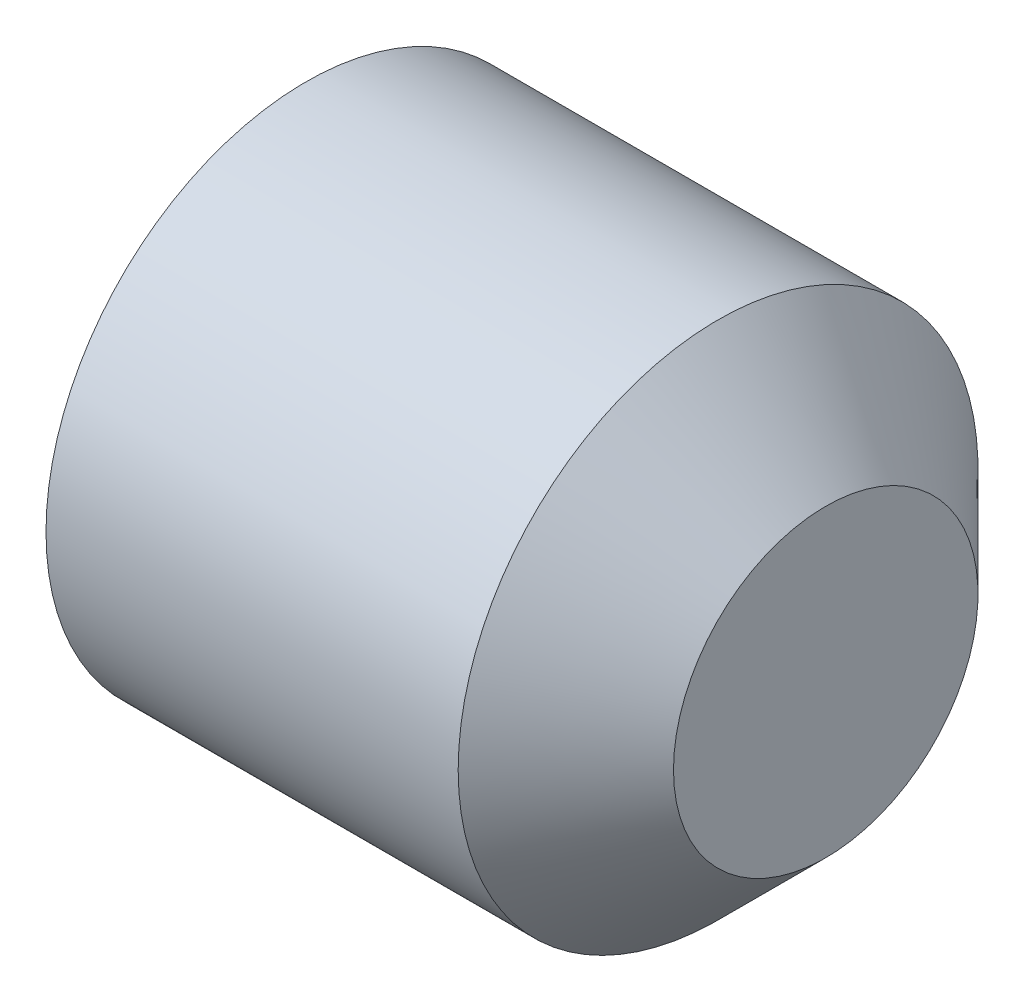
ISO-10303-21;
HEADER;
FILE_DESCRIPTION(('STEP AP214'),'2;1');
FILE_NAME('part.step','',(''),(''),'','','');
FILE_SCHEMA(('AUTOMOTIVE_DESIGN { 1 0 10303 214 1 1 1 1 }'));
ENDSEC;
DATA;
#1=APPLICATION_CONTEXT('core data for automotive mechanical design processes');
#2=APPLICATION_PROTOCOL_DEFINITION('international standard','automotive_design',2000,#1);
#3=PRODUCT_CONTEXT('',#1,'mechanical');
#4=PRODUCT('Part','Part','',(#3));
#5=PRODUCT_RELATED_PRODUCT_CATEGORY('part','',(#4));
#6=PRODUCT_DEFINITION_FORMATION('','',#4);
#7=PRODUCT_DEFINITION_CONTEXT('part definition',#1,'design');
#8=PRODUCT_DEFINITION('design','',#6,#7);
#9=PRODUCT_DEFINITION_SHAPE('','',#8);
#10=(LENGTH_UNIT() NAMED_UNIT(*) SI_UNIT(.MILLI.,.METRE.));
#11=(NAMED_UNIT(*) PLANE_ANGLE_UNIT() SI_UNIT($,.RADIAN.));
#12=(NAMED_UNIT(*) SI_UNIT($,.STERADIAN.) SOLID_ANGLE_UNIT());
#13=UNCERTAINTY_MEASURE_WITH_UNIT(LENGTH_MEASURE(1.E-05),#10,'distance_accuracy_value','');
#14=(GEOMETRIC_REPRESENTATION_CONTEXT(3) GLOBAL_UNCERTAINTY_ASSIGNED_CONTEXT((#13)) GLOBAL_UNIT_ASSIGNED_CONTEXT((#10,
#11,#12)) REPRESENTATION_CONTEXT('',''));
#15=CARTESIAN_POINT('',(0.,0.,0.));
#16=DIRECTION('',(0.,0.,1.));
#17=DIRECTION('',(1.,0.,0.));
#18=AXIS2_PLACEMENT_3D('',#15,#16,#17);
#19=CARTESIAN_POINT('',(0.,2.,0.));
#20=DIRECTION('',(1.,0.,0.));
#21=DIRECTION('',(0.,0.,-1.));
#22=AXIS2_PLACEMENT_3D('',#19,#20,#21);
#23=PLANE('',#22);
#24=DIRECTION('',(0.,-0.866025403784439,-0.5));
#25=VECTOR('',#24,1.);
#26=CARTESIAN_POINT('',(0.,1.,-0.577350269189626));
#27=LINE('',#26,#25);
#28=CARTESIAN_POINT('',(0.,1.,-0.577350269189626));
#29=VERTEX_POINT('',#28);
#30=CARTESIAN_POINT('',(0.,0.,-1.15470053837925));
#31=VERTEX_POINT('',#30);
#32=EDGE_CURVE('E122',#29,#31,#27,.T.);
#33=ORIENTED_EDGE('',*,*,#32,.F.);
#34=DIRECTION('',(0.,0.,-1.));
#35=VECTOR('',#34,1.);
#36=CARTESIAN_POINT('',(0.,1.,0.577350269189626));
#37=LINE('',#36,#35);
#38=CARTESIAN_POINT('',(0.,1.,0.577350269189626));
#39=VERTEX_POINT('',#38);
#40=EDGE_CURVE('E48',#39,#29,#37,.T.);
#41=ORIENTED_EDGE('',*,*,#40,.F.);
#42=DIRECTION('',(0.,0.866025403784439,-0.5));
#43=VECTOR('',#42,1.);
#44=CARTESIAN_POINT('',(0.,0.,1.15470053837925));
#45=LINE('',#44,#43);
#46=CARTESIAN_POINT('',(0.,0.,1.15470053837925));
#47=VERTEX_POINT('',#46);
#48=EDGE_CURVE('E131',#47,#39,#45,.T.);
#49=ORIENTED_EDGE('',*,*,#48,.F.);
#50=DIRECTION('',(0.,0.866025403784438,0.5));
#51=VECTOR('',#50,1.);
#52=CARTESIAN_POINT('',(0.,-1.,0.577350269189626));
#53=LINE('',#52,#51);
#54=CARTESIAN_POINT('',(0.,-1.,0.577350269189626));
#55=VERTEX_POINT('',#54);
#56=EDGE_CURVE('E129',#55,#47,#53,.T.);
#57=ORIENTED_EDGE('',*,*,#56,.F.);
#58=DIRECTION('',(0.,0.,1.));
#59=VECTOR('',#58,1.);
#60=CARTESIAN_POINT('',(0.,-1.,-0.577350269189626));
#61=LINE('',#60,#59);
#62=CARTESIAN_POINT('',(0.,-1.,-0.577350269189626));
#63=VERTEX_POINT('',#62);
#64=EDGE_CURVE('E96',#63,#55,#61,.T.);
#65=ORIENTED_EDGE('',*,*,#64,.F.);
#66=DIRECTION('',(0.,-0.866025403784439,0.5));
#67=VECTOR('',#66,1.);
#68=CARTESIAN_POINT('',(0.,0.,-1.15470053837925));
#69=LINE('',#68,#67);
#70=EDGE_CURVE('E125',#31,#63,#69,.T.);
#71=ORIENTED_EDGE('',*,*,#70,.F.);
#72=EDGE_LOOP('',(#33,#41,#49,#57,#65,#71));
#73=FACE_BOUND('',#72,.T.);
#74=CARTESIAN_POINT('',(0.,0.,0.));
#75=DIRECTION('',(-1.,0.,0.));
#76=DIRECTION('',(0.,0.,1.));
#77=AXIS2_PLACEMENT_3D('',#74,#75,#76);
#78=CIRCLE('',#77,2.);
#79=CARTESIAN_POINT('',(0.,0.,2.));
#80=VERTEX_POINT('',#79);
#81=EDGE_CURVE('E11',#80,#80,#78,.T.);
#82=ORIENTED_EDGE('',*,*,#81,.T.);
#83=EDGE_LOOP('',(#82));
#84=FACE_BOUND('',#83,.T.);
#85=ADVANCED_FACE('F34',(#73,#84),#23,.F.);
#86=CARTESIAN_POINT('',(0.,0.,0.));
#87=DIRECTION('',(-1.,0.,0.));
#88=DIRECTION('',(0.,0.,1.));
#89=AXIS2_PLACEMENT_3D('',#86,#87,#88);
#90=CYLINDRICAL_SURFACE('',#89,2.);
#91=ORIENTED_EDGE('',*,*,#81,.F.);
#92=EDGE_LOOP('',(#91));
#93=FACE_BOUND('',#92,.T.);
#94=CARTESIAN_POINT('',(3.17157287525381,0.,0.));
#95=DIRECTION('',(-1.,0.,0.));
#96=DIRECTION('',(0.,0.,1.));
#97=AXIS2_PLACEMENT_3D('',#94,#95,#96);
#98=CIRCLE('',#97,2.);
#99=CARTESIAN_POINT('',(3.17157287525381,0.,2.));
#100=VERTEX_POINT('',#99);
#101=EDGE_CURVE('E41',#100,#100,#98,.T.);
#102=ORIENTED_EDGE('',*,*,#101,.T.);
#103=EDGE_LOOP('',(#102));
#104=FACE_BOUND('',#103,.T.);
#105=ADVANCED_FACE('F145',(#93,#104),#90,.T.);
#106=CARTESIAN_POINT('',(4.,0.,0.));
#107=DIRECTION('',(-1.,0.,0.));
#108=DIRECTION('',(0.,0.,1.));
#109=AXIS2_PLACEMENT_3D('',#106,#107,#108);
#110=CONICAL_SURFACE('',#109,1.17157287525381,0.78539816339745);
#111=ORIENTED_EDGE('',*,*,#101,.F.);
#112=EDGE_LOOP('',(#111));
#113=FACE_BOUND('',#112,.T.);
#114=CARTESIAN_POINT('',(4.,0.,0.));
#115=DIRECTION('',(-1.,0.,0.));
#116=DIRECTION('',(0.,0.,1.));
#117=AXIS2_PLACEMENT_3D('',#114,#115,#116);
#118=CIRCLE('',#117,1.17157287525381);
#119=CARTESIAN_POINT('',(4.,0.,1.17157287525381));
#120=VERTEX_POINT('',#119);
#121=EDGE_CURVE('E135',#120,#120,#118,.T.);
#122=ORIENTED_EDGE('',*,*,#121,.T.);
#123=EDGE_LOOP('',(#122));
#124=FACE_BOUND('',#123,.T.);
#125=ADVANCED_FACE('F147',(#113,#124),#110,.T.);
#126=CARTESIAN_POINT('',(4.,1.17157287525381,0.));
#127=DIRECTION('',(-1.,0.,0.));
#128=DIRECTION('',(0.,0.,1.));
#129=AXIS2_PLACEMENT_3D('',#126,#127,#128);
#130=PLANE('',#129);
#131=ORIENTED_EDGE('',*,*,#121,.F.);
#132=EDGE_LOOP('',(#131));
#133=FACE_BOUND('',#132,.T.);
#134=ADVANCED_FACE('F150',(#133),#130,.F.);
#135=CARTESIAN_POINT('',(1.5,1.,0.577350269189626));
#136=DIRECTION('',(0.,1.,0.));
#137=DIRECTION('',(0.,0.,1.));
#138=AXIS2_PLACEMENT_3D('',#135,#136,#137);
#139=PLANE('',#138);
#140=ORIENTED_EDGE('',*,*,#40,.T.);
#141=DIRECTION('',(-1.,0.,0.));
#142=VECTOR('',#141,1.);
#143=CARTESIAN_POINT('',(1.5,1.,-0.577350269189626));
#144=LINE('',#143,#142);
#145=CARTESIAN_POINT('',(1.5,1.,-0.577350269189626));
#146=VERTEX_POINT('',#145);
#147=EDGE_CURVE('E78',#146,#29,#144,.T.);
#148=ORIENTED_EDGE('',*,*,#147,.F.);
#149=DIRECTION('',(0.,0.,-1.));
#150=VECTOR('',#149,1.);
#151=CARTESIAN_POINT('',(1.5,1.,0.577350269189626));
#152=LINE('',#151,#150);
#153=CARTESIAN_POINT('',(1.5,1.,0.577350269189626));
#154=VERTEX_POINT('',#153);
#155=EDGE_CURVE('E133',#154,#146,#152,.T.);
#156=ORIENTED_EDGE('',*,*,#155,.F.);
#157=DIRECTION('',(-1.,0.,0.));
#158=VECTOR('',#157,1.);
#159=CARTESIAN_POINT('',(1.5,1.,0.577350269189626));
#160=LINE('',#159,#158);
#161=EDGE_CURVE('E56',#154,#39,#160,.T.);
#162=ORIENTED_EDGE('',*,*,#161,.T.);
#163=EDGE_LOOP('',(#140,#148,#156,#162));
#164=FACE_BOUND('',#163,.T.);
#165=ADVANCED_FACE('F155',(#164),#139,.F.);
#166=CARTESIAN_POINT('',(1.5,0.,1.15470053837925));
#167=DIRECTION('',(0.,0.5,0.866025403784439));
#168=DIRECTION('',(0.,-0.866025403784439,0.5));
#169=AXIS2_PLACEMENT_3D('',#166,#167,#168);
#170=PLANE('',#169);
#171=ORIENTED_EDGE('',*,*,#48,.T.);
#172=ORIENTED_EDGE('',*,*,#161,.F.);
#173=DIRECTION('',(0.,0.866025403784439,-0.5));
#174=VECTOR('',#173,1.);
#175=CARTESIAN_POINT('',(1.5,0.,1.15470053837925));
#176=LINE('',#175,#174);
#177=CARTESIAN_POINT('',(1.5,0.,1.15470053837925));
#178=VERTEX_POINT('',#177);
#179=EDGE_CURVE('E108',#178,#154,#176,.T.);
#180=ORIENTED_EDGE('',*,*,#179,.F.);
#181=DIRECTION('',(-1.,0.,0.));
#182=VECTOR('',#181,1.);
#183=CARTESIAN_POINT('',(1.5,0.,1.15470053837925));
#184=LINE('',#183,#182);
#185=EDGE_CURVE('E100',#178,#47,#184,.T.);
#186=ORIENTED_EDGE('',*,*,#185,.T.);
#187=EDGE_LOOP('',(#171,#172,#180,#186));
#188=FACE_BOUND('',#187,.T.);
#189=ADVANCED_FACE('F160',(#188),#170,.F.);
#190=CARTESIAN_POINT('',(1.5,-1.,0.577350269189626));
#191=DIRECTION('',(0.,-0.5,0.866025403784439));
#192=DIRECTION('',(0.,-0.866025403784439,-0.5));
#193=AXIS2_PLACEMENT_3D('',#190,#191,#192);
#194=PLANE('',#193);
#195=ORIENTED_EDGE('',*,*,#56,.T.);
#196=ORIENTED_EDGE('',*,*,#185,.F.);
#197=DIRECTION('',(0.,0.866025403784438,0.5));
#198=VECTOR('',#197,1.);
#199=CARTESIAN_POINT('',(1.5,-1.,0.577350269189626));
#200=LINE('',#199,#198);
#201=CARTESIAN_POINT('',(1.5,-1.,0.577350269189626));
#202=VERTEX_POINT('',#201);
#203=EDGE_CURVE('E104',#202,#178,#200,.T.);
#204=ORIENTED_EDGE('',*,*,#203,.F.);
#205=DIRECTION('',(-1.,0.,0.));
#206=VECTOR('',#205,1.);
#207=CARTESIAN_POINT('',(1.5,-1.,0.577350269189626));
#208=LINE('',#207,#206);
#209=EDGE_CURVE('E89',#202,#55,#208,.T.);
#210=ORIENTED_EDGE('',*,*,#209,.T.);
#211=EDGE_LOOP('',(#195,#196,#204,#210));
#212=FACE_BOUND('',#211,.T.);
#213=ADVANCED_FACE('F105',(#212),#194,.F.);
#214=CARTESIAN_POINT('',(1.5,-1.,-0.577350269189626));
#215=DIRECTION('',(0.,-1.,0.));
#216=DIRECTION('',(0.,0.,-1.));
#217=AXIS2_PLACEMENT_3D('',#214,#215,#216);
#218=PLANE('',#217);
#219=ORIENTED_EDGE('',*,*,#64,.T.);
#220=ORIENTED_EDGE('',*,*,#209,.F.);
#221=DIRECTION('',(0.,0.,1.));
#222=VECTOR('',#221,1.);
#223=CARTESIAN_POINT('',(1.5,-1.,-0.577350269189626));
#224=LINE('',#223,#222);
#225=CARTESIAN_POINT('',(1.5,-1.,-0.577350269189626));
#226=VERTEX_POINT('',#225);
#227=EDGE_CURVE('E93',#226,#202,#224,.T.);
#228=ORIENTED_EDGE('',*,*,#227,.F.);
#229=DIRECTION('',(-1.,0.,0.));
#230=VECTOR('',#229,1.);
#231=CARTESIAN_POINT('',(1.5,-1.,-0.577350269189626));
#232=LINE('',#231,#230);
#233=EDGE_CURVE('E101',#226,#63,#232,.T.);
#234=ORIENTED_EDGE('',*,*,#233,.T.);
#235=EDGE_LOOP('',(#219,#220,#228,#234));
#236=FACE_BOUND('',#235,.T.);
#237=ADVANCED_FACE('F91',(#236),#218,.F.);
#238=CARTESIAN_POINT('',(1.5,0.,-1.15470053837925));
#239=DIRECTION('',(0.,-0.5,-0.866025403784439));
#240=DIRECTION('',(0.,0.866025403784439,-0.5));
#241=AXIS2_PLACEMENT_3D('',#238,#239,#240);
#242=PLANE('',#241);
#243=ORIENTED_EDGE('',*,*,#70,.T.);
#244=ORIENTED_EDGE('',*,*,#233,.F.);
#245=DIRECTION('',(0.,-0.866025403784439,0.5));
#246=VECTOR('',#245,1.);
#247=CARTESIAN_POINT('',(1.5,0.,-1.15470053837925));
#248=LINE('',#247,#246);
#249=CARTESIAN_POINT('',(1.5,0.,-1.15470053837925));
#250=VERTEX_POINT('',#249);
#251=EDGE_CURVE('E114',#250,#226,#248,.T.);
#252=ORIENTED_EDGE('',*,*,#251,.F.);
#253=DIRECTION('',(-1.,0.,0.));
#254=VECTOR('',#253,1.);
#255=CARTESIAN_POINT('',(1.5,0.,-1.15470053837925));
#256=LINE('',#255,#254);
#257=EDGE_CURVE('E138',#250,#31,#256,.T.);
#258=ORIENTED_EDGE('',*,*,#257,.T.);
#259=EDGE_LOOP('',(#243,#244,#252,#258));
#260=FACE_BOUND('',#259,.T.);
#261=ADVANCED_FACE('F186',(#260),#242,.F.);
#262=CARTESIAN_POINT('',(1.5,1.,-0.577350269189626));
#263=DIRECTION('',(0.,0.5,-0.866025403784438));
#264=DIRECTION('',(0.,0.866025403784439,0.5));
#265=AXIS2_PLACEMENT_3D('',#262,#263,#264);
#266=PLANE('',#265);
#267=ORIENTED_EDGE('',*,*,#32,.T.);
#268=ORIENTED_EDGE('',*,*,#257,.F.);
#269=DIRECTION('',(0.,-0.866025403784439,-0.5));
#270=VECTOR('',#269,1.);
#271=CARTESIAN_POINT('',(1.5,1.,-0.577350269189626));
#272=LINE('',#271,#270);
#273=EDGE_CURVE('E116',#146,#250,#272,.T.);
#274=ORIENTED_EDGE('',*,*,#273,.F.);
#275=ORIENTED_EDGE('',*,*,#147,.T.);
#276=EDGE_LOOP('',(#267,#268,#274,#275));
#277=FACE_BOUND('',#276,.T.);
#278=ADVANCED_FACE('F174',(#277),#266,.F.);
#279=CARTESIAN_POINT('',(1.5,1.,-1.73205080756888));
#280=DIRECTION('',(-1.,0.,0.));
#281=DIRECTION('',(0.,0.,1.));
#282=AXIS2_PLACEMENT_3D('',#279,#280,#281);
#283=PLANE('',#282);
#284=ORIENTED_EDGE('',*,*,#155,.T.);
#285=ORIENTED_EDGE('',*,*,#273,.T.);
#286=ORIENTED_EDGE('',*,*,#251,.T.);
#287=ORIENTED_EDGE('',*,*,#227,.T.);
#288=ORIENTED_EDGE('',*,*,#203,.T.);
#289=ORIENTED_EDGE('',*,*,#179,.T.);
#290=EDGE_LOOP('',(#284,#285,#286,#287,#288,#289));
#291=FACE_BOUND('',#290,.T.);
#292=ADVANCED_FACE('F111',(#291),#283,.T.);
#293=CLOSED_SHELL('',(#85,#105,#125,#134,#165,#189,#213,#237,#261,#278,#292));
#294=MANIFOLD_SOLID_BREP('B2',#293);
#295=ADVANCED_BREP_SHAPE_REPRESENTATION('',(#18,#294),#14);
#296=SHAPE_DEFINITION_REPRESENTATION(#9,#295);
ENDSEC;
END-ISO-10303-21;
